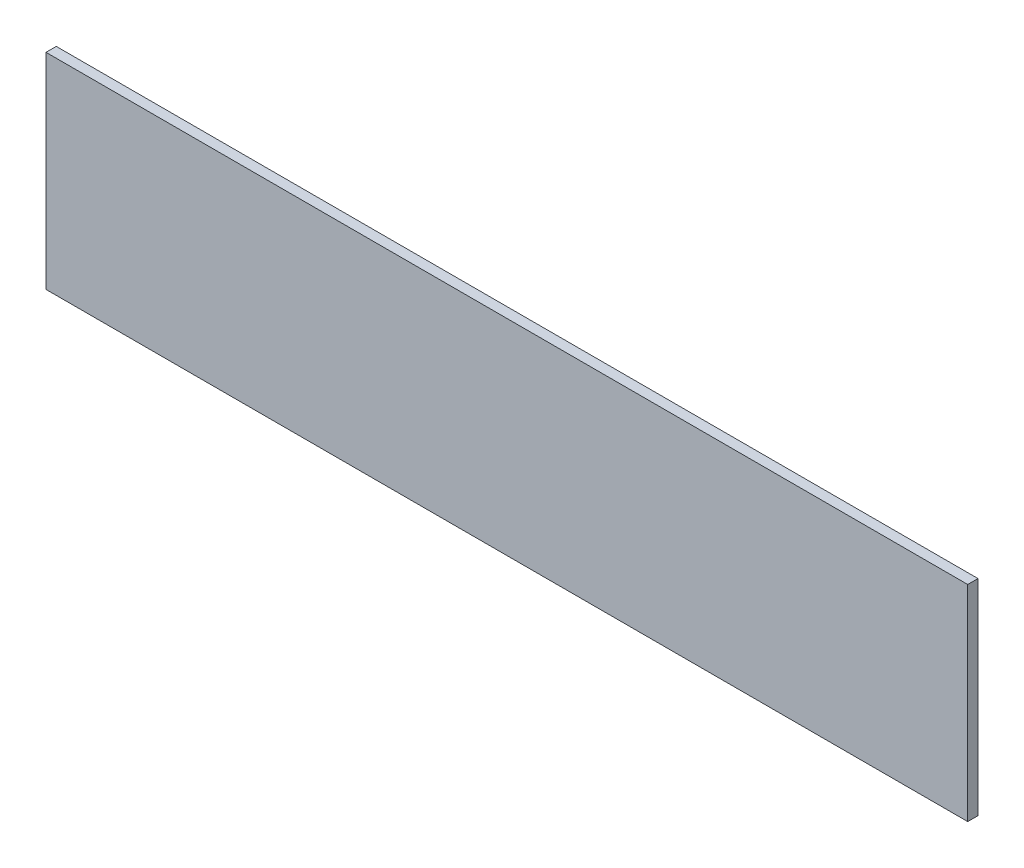
ISO-10303-21;
HEADER;
FILE_DESCRIPTION(('STEP AP214'),'2;1');
FILE_NAME('part.step','',(''),(''),'','','');
FILE_SCHEMA(('AUTOMOTIVE_DESIGN { 1 0 10303 214 1 1 1 1 }'));
ENDSEC;
DATA;
#1=APPLICATION_CONTEXT('core data for automotive mechanical design processes');
#2=APPLICATION_PROTOCOL_DEFINITION('international standard','automotive_design',2000,#1);
#3=PRODUCT_CONTEXT('',#1,'mechanical');
#4=PRODUCT('Part','Part','',(#3));
#5=PRODUCT_RELATED_PRODUCT_CATEGORY('part','',(#4));
#6=PRODUCT_DEFINITION_FORMATION('','',#4);
#7=PRODUCT_DEFINITION_CONTEXT('part definition',#1,'design');
#8=PRODUCT_DEFINITION('design','',#6,#7);
#9=PRODUCT_DEFINITION_SHAPE('','',#8);
#10=(LENGTH_UNIT() NAMED_UNIT(*) SI_UNIT(.MILLI.,.METRE.));
#11=(NAMED_UNIT(*) PLANE_ANGLE_UNIT() SI_UNIT($,.RADIAN.));
#12=(NAMED_UNIT(*) SI_UNIT($,.STERADIAN.) SOLID_ANGLE_UNIT());
#13=UNCERTAINTY_MEASURE_WITH_UNIT(LENGTH_MEASURE(1.E-05),#10,'distance_accuracy_value','');
#14=(GEOMETRIC_REPRESENTATION_CONTEXT(3) GLOBAL_UNCERTAINTY_ASSIGNED_CONTEXT((#13)) GLOBAL_UNIT_ASSIGNED_CONTEXT((#10,
#11,#12)) REPRESENTATION_CONTEXT('',''));
#15=CARTESIAN_POINT('',(0.,0.,0.));
#16=DIRECTION('',(0.,0.,1.));
#17=DIRECTION('',(1.,0.,0.));
#18=AXIS2_PLACEMENT_3D('',#15,#16,#17);
#19=CARTESIAN_POINT('',(-285.,63.5,3.175));
#20=DIRECTION('',(1.,0.,0.));
#21=DIRECTION('',(0.,0.,-1.));
#22=AXIS2_PLACEMENT_3D('',#19,#20,#21);
#23=PLANE('',#22);
#24=DIRECTION('',(0.,-1.,0.));
#25=VECTOR('',#24,1.);
#26=CARTESIAN_POINT('',(-285.,63.5,-3.175));
#27=LINE('',#26,#25);
#28=CARTESIAN_POINT('',(-285.,63.5,-3.175));
#29=VERTEX_POINT('',#28);
#30=CARTESIAN_POINT('',(-285.,-63.5,-3.175));
#31=VERTEX_POINT('',#30);
#32=EDGE_CURVE('E107',#29,#31,#27,.T.);
#33=ORIENTED_EDGE('',*,*,#32,.T.);
#34=DIRECTION('',(0.,0.,-1.));
#35=VECTOR('',#34,1.);
#36=CARTESIAN_POINT('',(-285.,-63.5,3.175));
#37=LINE('',#36,#35);
#38=CARTESIAN_POINT('',(-285.,-63.5,3.175));
#39=VERTEX_POINT('',#38);
#40=EDGE_CURVE('E11',#39,#31,#37,.T.);
#41=ORIENTED_EDGE('',*,*,#40,.F.);
#42=DIRECTION('',(0.,-1.,0.));
#43=VECTOR('',#42,1.);
#44=CARTESIAN_POINT('',(-285.,63.5,3.175));
#45=LINE('',#44,#43);
#46=CARTESIAN_POINT('',(-285.,63.5,3.175));
#47=VERTEX_POINT('',#46);
#48=EDGE_CURVE('E91',#47,#39,#45,.T.);
#49=ORIENTED_EDGE('',*,*,#48,.F.);
#50=DIRECTION('',(0.,0.,-1.));
#51=VECTOR('',#50,1.);
#52=CARTESIAN_POINT('',(-285.,63.5,3.175));
#53=LINE('',#52,#51);
#54=EDGE_CURVE('E103',#47,#29,#53,.T.);
#55=ORIENTED_EDGE('',*,*,#54,.T.);
#56=EDGE_LOOP('',(#33,#41,#49,#55));
#57=FACE_BOUND('',#56,.T.);
#58=ADVANCED_FACE('F39',(#57),#23,.F.);
#59=CARTESIAN_POINT('',(-285.,-63.5,3.175));
#60=DIRECTION('',(0.,1.,0.));
#61=DIRECTION('',(0.,0.,1.));
#62=AXIS2_PLACEMENT_3D('',#59,#60,#61);
#63=PLANE('',#62);
#64=DIRECTION('',(1.,0.,0.));
#65=VECTOR('',#64,1.);
#66=CARTESIAN_POINT('',(-285.,-63.5,-3.175));
#67=LINE('',#66,#65);
#68=CARTESIAN_POINT('',(285.,-63.5,-3.175));
#69=VERTEX_POINT('',#68);
#70=EDGE_CURVE('E96',#31,#69,#67,.T.);
#71=ORIENTED_EDGE('',*,*,#70,.T.);
#72=DIRECTION('',(0.,0.,-1.));
#73=VECTOR('',#72,1.);
#74=CARTESIAN_POINT('',(285.,-63.5,3.175));
#75=LINE('',#74,#73);
#76=CARTESIAN_POINT('',(285.,-63.5,3.175));
#77=VERTEX_POINT('',#76);
#78=EDGE_CURVE('E48',#77,#69,#75,.T.);
#79=ORIENTED_EDGE('',*,*,#78,.F.);
#80=DIRECTION('',(1.,0.,0.));
#81=VECTOR('',#80,1.);
#82=CARTESIAN_POINT('',(-285.,-63.5,3.175));
#83=LINE('',#82,#81);
#84=EDGE_CURVE('E86',#39,#77,#83,.T.);
#85=ORIENTED_EDGE('',*,*,#84,.F.);
#86=ORIENTED_EDGE('',*,*,#40,.T.);
#87=EDGE_LOOP('',(#71,#79,#85,#86));
#88=FACE_BOUND('',#87,.T.);
#89=ADVANCED_FACE('F95',(#88),#63,.F.);
#90=CARTESIAN_POINT('',(285.,63.5,3.175));
#91=DIRECTION('',(-1.,0.,0.));
#92=DIRECTION('',(0.,0.,1.));
#93=AXIS2_PLACEMENT_3D('',#90,#91,#92);
#94=PLANE('',#93);
#95=DIRECTION('',(0.,1.,0.));
#96=VECTOR('',#95,1.);
#97=CARTESIAN_POINT('',(285.,63.5,-3.175));
#98=LINE('',#97,#96);
#99=CARTESIAN_POINT('',(285.,63.5,-3.175));
#100=VERTEX_POINT('',#99);
#101=EDGE_CURVE('E73',#69,#100,#98,.T.);
#102=ORIENTED_EDGE('',*,*,#101,.T.);
#103=DIRECTION('',(0.,0.,-1.));
#104=VECTOR('',#103,1.);
#105=CARTESIAN_POINT('',(285.,63.5,3.175));
#106=LINE('',#105,#104);
#107=CARTESIAN_POINT('',(285.,63.5,3.175));
#108=VERTEX_POINT('',#107);
#109=EDGE_CURVE('E98',#108,#100,#106,.T.);
#110=ORIENTED_EDGE('',*,*,#109,.F.);
#111=DIRECTION('',(0.,1.,0.));
#112=VECTOR('',#111,1.);
#113=CARTESIAN_POINT('',(285.,63.5,3.175));
#114=LINE('',#113,#112);
#115=EDGE_CURVE('E89',#77,#108,#114,.T.);
#116=ORIENTED_EDGE('',*,*,#115,.F.);
#117=ORIENTED_EDGE('',*,*,#78,.T.);
#118=EDGE_LOOP('',(#102,#110,#116,#117));
#119=FACE_BOUND('',#118,.T.);
#120=ADVANCED_FACE('F99',(#119),#94,.F.);
#121=CARTESIAN_POINT('',(-285.,63.5,3.175));
#122=DIRECTION('',(0.,-1.,0.));
#123=DIRECTION('',(0.,0.,-1.));
#124=AXIS2_PLACEMENT_3D('',#121,#122,#123);
#125=PLANE('',#124);
#126=DIRECTION('',(-1.,0.,0.));
#127=VECTOR('',#126,1.);
#128=CARTESIAN_POINT('',(-285.,63.5,-3.175));
#129=LINE('',#128,#127);
#130=EDGE_CURVE('E79',#100,#29,#129,.T.);
#131=ORIENTED_EDGE('',*,*,#130,.T.);
#132=ORIENTED_EDGE('',*,*,#54,.F.);
#133=DIRECTION('',(-1.,0.,0.));
#134=VECTOR('',#133,1.);
#135=CARTESIAN_POINT('',(-285.,63.5,3.175));
#136=LINE('',#135,#134);
#137=EDGE_CURVE('E56',#108,#47,#136,.T.);
#138=ORIENTED_EDGE('',*,*,#137,.F.);
#139=ORIENTED_EDGE('',*,*,#109,.T.);
#140=EDGE_LOOP('',(#131,#132,#138,#139));
#141=FACE_BOUND('',#140,.T.);
#142=ADVANCED_FACE('F120',(#141),#125,.F.);
#143=CARTESIAN_POINT('',(0.,0.,3.175));
#144=DIRECTION('',(0.,0.,1.));
#145=DIRECTION('',(1.,0.,0.));
#146=AXIS2_PLACEMENT_3D('',#143,#144,#145);
#147=PLANE('',#146);
#148=ORIENTED_EDGE('',*,*,#48,.T.);
#149=ORIENTED_EDGE('',*,*,#84,.T.);
#150=ORIENTED_EDGE('',*,*,#115,.T.);
#151=ORIENTED_EDGE('',*,*,#137,.T.);
#152=EDGE_LOOP('',(#148,#149,#150,#151));
#153=FACE_BOUND('',#152,.T.);
#154=ADVANCED_FACE('F87',(#153),#147,.T.);
#155=CARTESIAN_POINT('',(0.,0.,-3.175));
#156=DIRECTION('',(0.,0.,1.));
#157=DIRECTION('',(1.,0.,0.));
#158=AXIS2_PLACEMENT_3D('',#155,#156,#157);
#159=PLANE('',#158);
#160=ORIENTED_EDGE('',*,*,#32,.F.);
#161=ORIENTED_EDGE('',*,*,#130,.F.);
#162=ORIENTED_EDGE('',*,*,#101,.F.);
#163=ORIENTED_EDGE('',*,*,#70,.F.);
#164=EDGE_LOOP('',(#160,#161,#162,#163));
#165=FACE_BOUND('',#164,.T.);
#166=ADVANCED_FACE('F123',(#165),#159,.F.);
#167=CLOSED_SHELL('',(#58,#89,#120,#142,#154,#166));
#168=MANIFOLD_SOLID_BREP('B2',#167);
#169=ADVANCED_BREP_SHAPE_REPRESENTATION('',(#18,#168),#14);
#170=SHAPE_DEFINITION_REPRESENTATION(#9,#169);
ENDSEC;
END-ISO-10303-21;
